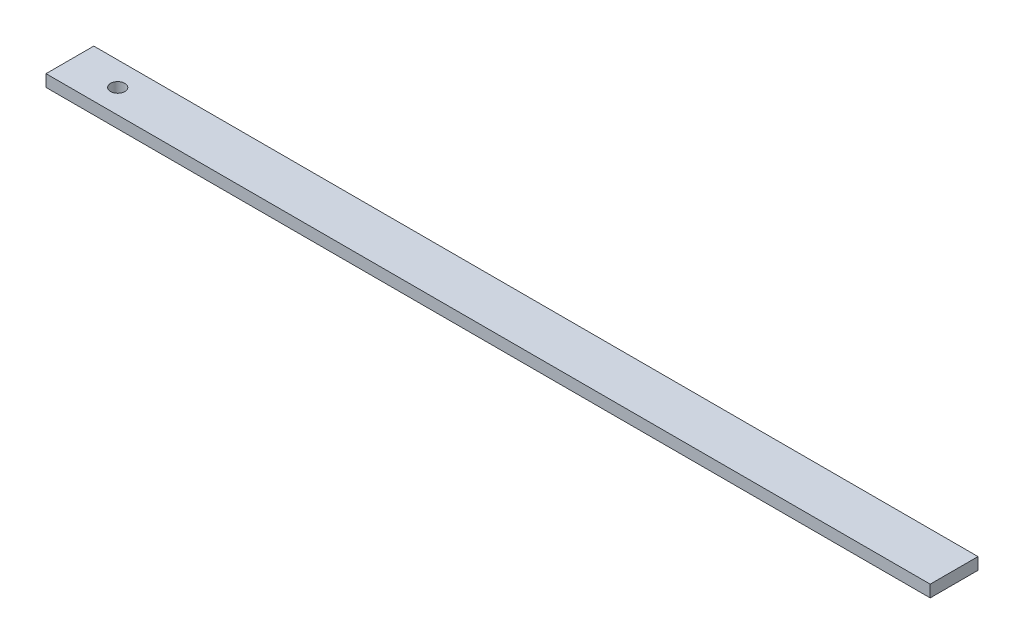
ISO-10303-21;
HEADER;
FILE_DESCRIPTION(('STEP AP214'),'2;1');
FILE_NAME('part.step','',(''),(''),'','','');
FILE_SCHEMA(('AUTOMOTIVE_DESIGN { 1 0 10303 214 1 1 1 1 }'));
ENDSEC;
DATA;
#1=APPLICATION_CONTEXT('core data for automotive mechanical design processes');
#2=APPLICATION_PROTOCOL_DEFINITION('international standard','automotive_design',2000,#1);
#3=PRODUCT_CONTEXT('',#1,'mechanical');
#4=PRODUCT('Part','Part','',(#3));
#5=PRODUCT_RELATED_PRODUCT_CATEGORY('part','',(#4));
#6=PRODUCT_DEFINITION_FORMATION('','',#4);
#7=PRODUCT_DEFINITION_CONTEXT('part definition',#1,'design');
#8=PRODUCT_DEFINITION('design','',#6,#7);
#9=PRODUCT_DEFINITION_SHAPE('','',#8);
#10=(LENGTH_UNIT() NAMED_UNIT(*) SI_UNIT(.MILLI.,.METRE.));
#11=(NAMED_UNIT(*) PLANE_ANGLE_UNIT() SI_UNIT($,.RADIAN.));
#12=(NAMED_UNIT(*) SI_UNIT($,.STERADIAN.) SOLID_ANGLE_UNIT());
#13=UNCERTAINTY_MEASURE_WITH_UNIT(LENGTH_MEASURE(1.E-05),#10,'distance_accuracy_value','');
#14=(GEOMETRIC_REPRESENTATION_CONTEXT(3) GLOBAL_UNCERTAINTY_ASSIGNED_CONTEXT((#13)) GLOBAL_UNIT_ASSIGNED_CONTEXT((#10,
#11,#12)) REPRESENTATION_CONTEXT('',''));
#15=CARTESIAN_POINT('',(0.,0.,0.));
#16=DIRECTION('',(0.,0.,1.));
#17=DIRECTION('',(1.,0.,0.));
#18=AXIS2_PLACEMENT_3D('',#15,#16,#17);
#19=CARTESIAN_POINT('',(-234.95,1.5875,-6.35));
#20=DIRECTION('',(0.,0.,-1.));
#21=DIRECTION('',(-1.,0.,0.));
#22=AXIS2_PLACEMENT_3D('',#19,#20,#21);
#23=PLANE('',#22);
#24=DIRECTION('',(0.,1.,0.));
#25=VECTOR('',#24,1.);
#26=CARTESIAN_POINT('',(0.,1.5875,-6.35));
#27=LINE('',#26,#25);
#28=CARTESIAN_POINT('',(0.,-1.5875,-6.35));
#29=VERTEX_POINT('',#28);
#30=CARTESIAN_POINT('',(0.,1.5875,-6.35));
#31=VERTEX_POINT('',#30);
#32=EDGE_CURVE('E109',#29,#31,#27,.T.);
#33=ORIENTED_EDGE('',*,*,#32,.F.);
#34=DIRECTION('',(1.,0.,0.));
#35=VECTOR('',#34,1.);
#36=CARTESIAN_POINT('',(-234.95,-1.5875,-6.35));
#37=LINE('',#36,#35);
#38=CARTESIAN_POINT('',(-234.95,-1.5875,-6.35));
#39=VERTEX_POINT('',#38);
#40=EDGE_CURVE('E12',#39,#29,#37,.T.);
#41=ORIENTED_EDGE('',*,*,#40,.F.);
#42=DIRECTION('',(0.,1.,0.));
#43=VECTOR('',#42,1.);
#44=CARTESIAN_POINT('',(-234.95,1.5875,-6.35));
#45=LINE('',#44,#43);
#46=CARTESIAN_POINT('',(-234.95,1.5875,-6.35));
#47=VERTEX_POINT('',#46);
#48=EDGE_CURVE('E102',#39,#47,#45,.T.);
#49=ORIENTED_EDGE('',*,*,#48,.T.);
#50=DIRECTION('',(1.,0.,0.));
#51=VECTOR('',#50,1.);
#52=CARTESIAN_POINT('',(-234.95,1.5875,-6.35));
#53=LINE('',#52,#51);
#54=EDGE_CURVE('E47',#47,#31,#53,.T.);
#55=ORIENTED_EDGE('',*,*,#54,.T.);
#56=EDGE_LOOP('',(#33,#41,#49,#55));
#57=FACE_BOUND('',#56,.T.);
#58=ADVANCED_FACE('F44',(#57),#23,.T.);
#59=CARTESIAN_POINT('',(-234.95,-1.5875,6.35));
#60=DIRECTION('',(0.,-1.,0.));
#61=DIRECTION('',(0.,0.,-1.));
#62=AXIS2_PLACEMENT_3D('',#59,#60,#61);
#63=PLANE('',#62);
#64=CARTESIAN_POINT('',(-222.25,-1.5875,0.));
#65=DIRECTION('',(0.,1.,0.));
#66=DIRECTION('',(0.,0.,1.));
#67=AXIS2_PLACEMENT_3D('',#64,#65,#66);
#68=CIRCLE('',#67,1.89865);
#69=CARTESIAN_POINT('',(-222.25,-1.5875,1.89865));
#70=VERTEX_POINT('',#69);
#71=EDGE_CURVE('E113',#70,#70,#68,.T.);
#72=ORIENTED_EDGE('',*,*,#71,.T.);
#73=EDGE_LOOP('',(#72));
#74=FACE_BOUND('',#73,.T.);
#75=DIRECTION('',(0.,0.,-1.));
#76=VECTOR('',#75,1.);
#77=CARTESIAN_POINT('',(0.,-1.5875,6.35));
#78=LINE('',#77,#76);
#79=CARTESIAN_POINT('',(0.,-1.5875,6.35));
#80=VERTEX_POINT('',#79);
#81=EDGE_CURVE('E104',#80,#29,#78,.T.);
#82=ORIENTED_EDGE('',*,*,#81,.F.);
#83=DIRECTION('',(1.,0.,0.));
#84=VECTOR('',#83,1.);
#85=CARTESIAN_POINT('',(-234.95,-1.5875,6.35));
#86=LINE('',#85,#84);
#87=CARTESIAN_POINT('',(-234.95,-1.5875,6.35));
#88=VERTEX_POINT('',#87);
#89=EDGE_CURVE('E53',#88,#80,#86,.T.);
#90=ORIENTED_EDGE('',*,*,#89,.F.);
#91=DIRECTION('',(0.,0.,-1.));
#92=VECTOR('',#91,1.);
#93=CARTESIAN_POINT('',(-234.95,-1.5875,6.35));
#94=LINE('',#93,#92);
#95=EDGE_CURVE('E99',#88,#39,#94,.T.);
#96=ORIENTED_EDGE('',*,*,#95,.T.);
#97=ORIENTED_EDGE('',*,*,#40,.T.);
#98=EDGE_LOOP('',(#82,#90,#96,#97));
#99=FACE_BOUND('',#98,.T.);
#100=ADVANCED_FACE('F120',(#74,#99),#63,.T.);
#101=CARTESIAN_POINT('',(-234.95,1.5875,6.35));
#102=DIRECTION('',(0.,0.,1.));
#103=DIRECTION('',(1.,0.,0.));
#104=AXIS2_PLACEMENT_3D('',#101,#102,#103);
#105=PLANE('',#104);
#106=DIRECTION('',(0.,-1.,0.));
#107=VECTOR('',#106,1.);
#108=CARTESIAN_POINT('',(0.,1.5875,6.35));
#109=LINE('',#108,#107);
#110=CARTESIAN_POINT('',(0.,1.5875,6.35));
#111=VERTEX_POINT('',#110);
#112=EDGE_CURVE('E94',#111,#80,#109,.T.);
#113=ORIENTED_EDGE('',*,*,#112,.F.);
#114=DIRECTION('',(1.,0.,0.));
#115=VECTOR('',#114,1.);
#116=CARTESIAN_POINT('',(-234.95,1.5875,6.35));
#117=LINE('',#116,#115);
#118=CARTESIAN_POINT('',(-234.95,1.5875,6.35));
#119=VERTEX_POINT('',#118);
#120=EDGE_CURVE('E89',#119,#111,#117,.T.);
#121=ORIENTED_EDGE('',*,*,#120,.F.);
#122=DIRECTION('',(0.,-1.,0.));
#123=VECTOR('',#122,1.);
#124=CARTESIAN_POINT('',(-234.95,1.5875,6.35));
#125=LINE('',#124,#123);
#126=EDGE_CURVE('E92',#119,#88,#125,.T.);
#127=ORIENTED_EDGE('',*,*,#126,.T.);
#128=ORIENTED_EDGE('',*,*,#89,.T.);
#129=EDGE_LOOP('',(#113,#121,#127,#128));
#130=FACE_BOUND('',#129,.T.);
#131=ADVANCED_FACE('F91',(#130),#105,.T.);
#132=CARTESIAN_POINT('',(-234.95,1.5875,6.35));
#133=DIRECTION('',(0.,1.,0.));
#134=DIRECTION('',(0.,0.,1.));
#135=AXIS2_PLACEMENT_3D('',#132,#133,#134);
#136=PLANE('',#135);
#137=CARTESIAN_POINT('',(-222.25,1.5875,0.));
#138=DIRECTION('',(0.,1.,0.));
#139=DIRECTION('',(0.,0.,1.));
#140=AXIS2_PLACEMENT_3D('',#137,#138,#139);
#141=CIRCLE('',#140,1.89865);
#142=CARTESIAN_POINT('',(-222.25,1.5875,1.89865));
#143=VERTEX_POINT('',#142);
#144=EDGE_CURVE('E139',#143,#143,#141,.T.);
#145=ORIENTED_EDGE('',*,*,#144,.F.);
#146=EDGE_LOOP('',(#145));
#147=FACE_BOUND('',#146,.T.);
#148=DIRECTION('',(0.,0.,1.));
#149=VECTOR('',#148,1.);
#150=CARTESIAN_POINT('',(0.,1.5875,6.35));
#151=LINE('',#150,#149);
#152=EDGE_CURVE('E112',#31,#111,#151,.T.);
#153=ORIENTED_EDGE('',*,*,#152,.F.);
#154=ORIENTED_EDGE('',*,*,#54,.F.);
#155=DIRECTION('',(0.,0.,1.));
#156=VECTOR('',#155,1.);
#157=CARTESIAN_POINT('',(-234.95,1.5875,6.35));
#158=LINE('',#157,#156);
#159=EDGE_CURVE('E98',#47,#119,#158,.T.);
#160=ORIENTED_EDGE('',*,*,#159,.T.);
#161=ORIENTED_EDGE('',*,*,#120,.T.);
#162=EDGE_LOOP('',(#153,#154,#160,#161));
#163=FACE_BOUND('',#162,.T.);
#164=ADVANCED_FACE('F101',(#147,#163),#136,.T.);
#165=CARTESIAN_POINT('',(-234.95,0.,0.));
#166=DIRECTION('',(1.,0.,0.));
#167=DIRECTION('',(0.,0.,-1.));
#168=AXIS2_PLACEMENT_3D('',#165,#166,#167);
#169=PLANE('',#168);
#170=ORIENTED_EDGE('',*,*,#48,.F.);
#171=ORIENTED_EDGE('',*,*,#95,.F.);
#172=ORIENTED_EDGE('',*,*,#126,.F.);
#173=ORIENTED_EDGE('',*,*,#159,.F.);
#174=EDGE_LOOP('',(#170,#171,#172,#173));
#175=FACE_BOUND('',#174,.T.);
#176=ADVANCED_FACE('F97',(#175),#169,.F.);
#177=CARTESIAN_POINT('',(0.,0.,0.));
#178=DIRECTION('',(1.,0.,0.));
#179=DIRECTION('',(0.,0.,-1.));
#180=AXIS2_PLACEMENT_3D('',#177,#178,#179);
#181=PLANE('',#180);
#182=ORIENTED_EDGE('',*,*,#32,.T.);
#183=ORIENTED_EDGE('',*,*,#152,.T.);
#184=ORIENTED_EDGE('',*,*,#112,.T.);
#185=ORIENTED_EDGE('',*,*,#81,.T.);
#186=EDGE_LOOP('',(#182,#183,#184,#185));
#187=FACE_BOUND('',#186,.T.);
#188=ADVANCED_FACE('F119',(#187),#181,.T.);
#189=CARTESIAN_POINT('',(-222.25,1.5875,0.));
#190=DIRECTION('',(0.,1.,0.));
#191=DIRECTION('',(0.,0.,1.));
#192=AXIS2_PLACEMENT_3D('',#189,#190,#191);
#193=CYLINDRICAL_SURFACE('',#192,1.89865);
#194=ORIENTED_EDGE('',*,*,#71,.F.);
#195=EDGE_LOOP('',(#194));
#196=FACE_BOUND('',#195,.T.);
#197=ORIENTED_EDGE('',*,*,#144,.T.);
#198=EDGE_LOOP('',(#197));
#199=FACE_BOUND('',#198,.T.);
#200=ADVANCED_FACE('F145',(#196,#199),#193,.F.);
#201=CLOSED_SHELL('',(#58,#100,#131,#164,#176,#188,#200));
#202=MANIFOLD_SOLID_BREP('B2',#201);
#203=ADVANCED_BREP_SHAPE_REPRESENTATION('',(#18,#202),#14);
#204=SHAPE_DEFINITION_REPRESENTATION(#9,#203);
ENDSEC;
END-ISO-10303-21;
